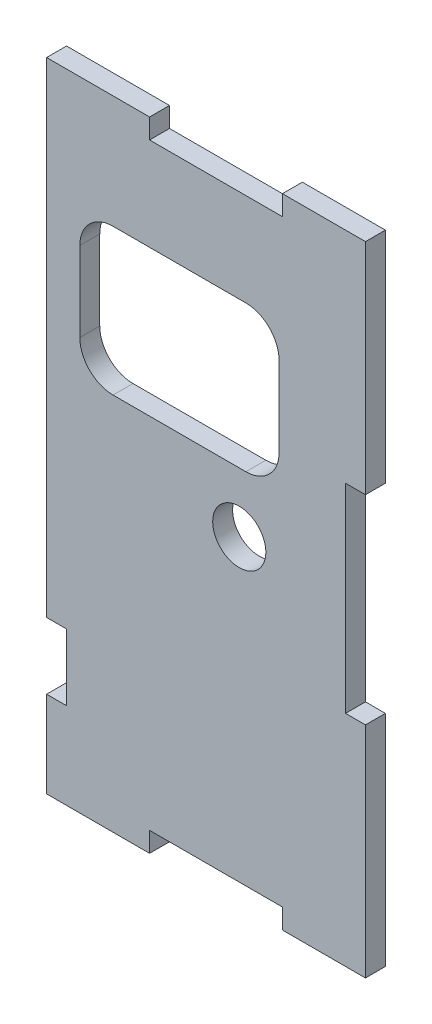
ISO-10303-21;
HEADER;
FILE_DESCRIPTION(('STEP AP214'),'2;1');
FILE_NAME('part.step','',(''),(''),'','','');
FILE_SCHEMA(('AUTOMOTIVE_DESIGN { 1 0 10303 214 1 1 1 1 }'));
ENDSEC;
DATA;
#1=APPLICATION_CONTEXT('core data for automotive mechanical design processes');
#2=APPLICATION_PROTOCOL_DEFINITION('international standard','automotive_design',2000,#1);
#3=PRODUCT_CONTEXT('',#1,'mechanical');
#4=PRODUCT('Part','Part','',(#3));
#5=PRODUCT_RELATED_PRODUCT_CATEGORY('part','',(#4));
#6=PRODUCT_DEFINITION_FORMATION('','',#4);
#7=PRODUCT_DEFINITION_CONTEXT('part definition',#1,'design');
#8=PRODUCT_DEFINITION('design','',#6,#7);
#9=PRODUCT_DEFINITION_SHAPE('','',#8);
#10=(LENGTH_UNIT() NAMED_UNIT(*) SI_UNIT(.MILLI.,.METRE.));
#11=(NAMED_UNIT(*) PLANE_ANGLE_UNIT() SI_UNIT($,.RADIAN.));
#12=(NAMED_UNIT(*) SI_UNIT($,.STERADIAN.) SOLID_ANGLE_UNIT());
#13=UNCERTAINTY_MEASURE_WITH_UNIT(LENGTH_MEASURE(1.E-05),#10,'distance_accuracy_value','');
#14=(GEOMETRIC_REPRESENTATION_CONTEXT(3) GLOBAL_UNCERTAINTY_ASSIGNED_CONTEXT((#13)) GLOBAL_UNIT_ASSIGNED_CONTEXT((#10,
#11,#12)) REPRESENTATION_CONTEXT('',''));
#15=CARTESIAN_POINT('',(0.,0.,0.));
#16=DIRECTION('',(0.,0.,1.));
#17=DIRECTION('',(1.,0.,0.));
#18=AXIS2_PLACEMENT_3D('',#15,#16,#17);
#19=CARTESIAN_POINT('',(48.,96.,3.));
#20=DIRECTION('',(-1.,0.,0.));
#21=DIRECTION('',(0.,-1.,0.));
#22=AXIS2_PLACEMENT_3D('',#19,#20,#21);
#23=PLANE('',#22);
#24=DIRECTION('',(0.,1.,0.));
#25=VECTOR('',#24,1.);
#26=CARTESIAN_POINT('',(48.,96.,3.));
#27=LINE('',#26,#25);
#28=CARTESIAN_POINT('',(48.,63.,3.));
#29=VERTEX_POINT('',#28);
#30=CARTESIAN_POINT('',(48.,96.,3.));
#31=VERTEX_POINT('',#30);
#32=EDGE_CURVE('E357',#29,#31,#27,.T.);
#33=ORIENTED_EDGE('',*,*,#32,.F.);
#34=DIRECTION('',(0.,0.,-1.));
#35=VECTOR('',#34,1.);
#36=CARTESIAN_POINT('',(48.,63.,3.));
#37=LINE('',#36,#35);
#38=CARTESIAN_POINT('',(48.,63.,0.));
#39=VERTEX_POINT('',#38);
#40=EDGE_CURVE('E304',#29,#39,#37,.T.);
#41=ORIENTED_EDGE('',*,*,#40,.T.);
#42=DIRECTION('',(0.,1.,0.));
#43=VECTOR('',#42,1.);
#44=CARTESIAN_POINT('',(48.,96.,0.));
#45=LINE('',#44,#43);
#46=CARTESIAN_POINT('',(48.,96.,0.));
#47=VERTEX_POINT('',#46);
#48=EDGE_CURVE('E386',#39,#47,#45,.T.);
#49=ORIENTED_EDGE('',*,*,#48,.T.);
#50=DIRECTION('',(0.,0.,-1.));
#51=VECTOR('',#50,1.);
#52=CARTESIAN_POINT('',(48.,96.,3.));
#53=LINE('',#52,#51);
#54=EDGE_CURVE('E420',#31,#47,#53,.T.);
#55=ORIENTED_EDGE('',*,*,#54,.F.);
#56=EDGE_LOOP('',(#33,#41,#49,#55));
#57=FACE_BOUND('',#56,.T.);
#58=ADVANCED_FACE('F33',(#57),#23,.F.);
#59=CARTESIAN_POINT('',(0.,0.,3.));
#60=DIRECTION('',(1.,0.,0.));
#61=DIRECTION('',(0.,0.,-1.));
#62=AXIS2_PLACEMENT_3D('',#59,#60,#61);
#63=PLANE('',#62);
#64=DIRECTION('',(0.,-1.,0.));
#65=VECTOR('',#64,1.);
#66=CARTESIAN_POINT('',(0.,0.,3.));
#67=LINE('',#66,#65);
#68=CARTESIAN_POINT('',(0.,13.,3.));
#69=VERTEX_POINT('',#68);
#70=CARTESIAN_POINT('',(0.,0.,3.));
#71=VERTEX_POINT('',#70);
#72=EDGE_CURVE('E371',#69,#71,#67,.T.);
#73=ORIENTED_EDGE('',*,*,#72,.F.);
#74=DIRECTION('',(0.,0.,1.));
#75=VECTOR('',#74,1.);
#76=CARTESIAN_POINT('',(0.,13.,0.));
#77=LINE('',#76,#75);
#78=CARTESIAN_POINT('',(0.,13.,0.));
#79=VERTEX_POINT('',#78);
#80=EDGE_CURVE('E339',#79,#69,#77,.T.);
#81=ORIENTED_EDGE('',*,*,#80,.F.);
#82=DIRECTION('',(0.,-1.,0.));
#83=VECTOR('',#82,1.);
#84=CARTESIAN_POINT('',(0.,0.,0.));
#85=LINE('',#84,#83);
#86=CARTESIAN_POINT('',(0.,0.,0.));
#87=VERTEX_POINT('',#86);
#88=EDGE_CURVE('E400',#79,#87,#85,.T.);
#89=ORIENTED_EDGE('',*,*,#88,.T.);
#90=DIRECTION('',(0.,0.,-1.));
#91=VECTOR('',#90,1.);
#92=CARTESIAN_POINT('',(0.,0.,3.));
#93=LINE('',#92,#91);
#94=EDGE_CURVE('E375',#71,#87,#93,.T.);
#95=ORIENTED_EDGE('',*,*,#94,.F.);
#96=EDGE_LOOP('',(#73,#81,#89,#95));
#97=FACE_BOUND('',#96,.T.);
#98=ADVANCED_FACE('F466',(#97),#63,.F.);
#99=CARTESIAN_POINT('',(15.5,0.,3.));
#100=DIRECTION('',(0.,1.,0.));
#101=DIRECTION('',(-1.,0.,0.));
#102=AXIS2_PLACEMENT_3D('',#99,#100,#101);
#103=PLANE('',#102);
#104=DIRECTION('',(1.,0.,0.));
#105=VECTOR('',#104,1.);
#106=CARTESIAN_POINT('',(15.5,0.,0.));
#107=LINE('',#106,#105);
#108=CARTESIAN_POINT('',(15.5,0.,0.));
#109=VERTEX_POINT('',#108);
#110=EDGE_CURVE('E338',#87,#109,#107,.T.);
#111=ORIENTED_EDGE('',*,*,#110,.T.);
#112=DIRECTION('',(0.,0.,-1.));
#113=VECTOR('',#112,1.);
#114=CARTESIAN_POINT('',(15.5,0.,3.));
#115=LINE('',#114,#113);
#116=CARTESIAN_POINT('',(15.5,0.,3.));
#117=VERTEX_POINT('',#116);
#118=EDGE_CURVE('E11',#117,#109,#115,.T.);
#119=ORIENTED_EDGE('',*,*,#118,.F.);
#120=DIRECTION('',(1.,0.,0.));
#121=VECTOR('',#120,1.);
#122=CARTESIAN_POINT('',(15.5,0.,3.));
#123=LINE('',#122,#121);
#124=EDGE_CURVE('E345',#71,#117,#123,.T.);
#125=ORIENTED_EDGE('',*,*,#124,.F.);
#126=ORIENTED_EDGE('',*,*,#94,.T.);
#127=EDGE_LOOP('',(#111,#119,#125,#126));
#128=FACE_BOUND('',#127,.T.);
#129=ADVANCED_FACE('F35',(#128),#103,.F.);
#130=CARTESIAN_POINT('',(15.5,3.,3.));
#131=DIRECTION('',(-1.,0.,0.));
#132=DIRECTION('',(0.,-1.,0.));
#133=AXIS2_PLACEMENT_3D('',#130,#131,#132);
#134=PLANE('',#133);
#135=DIRECTION('',(0.,1.,0.));
#136=VECTOR('',#135,1.);
#137=CARTESIAN_POINT('',(15.5,3.,0.));
#138=LINE('',#137,#136);
#139=CARTESIAN_POINT('',(15.5,3.,0.));
#140=VERTEX_POINT('',#139);
#141=EDGE_CURVE('E378',#109,#140,#138,.T.);
#142=ORIENTED_EDGE('',*,*,#141,.T.);
#143=DIRECTION('',(0.,0.,-1.));
#144=VECTOR('',#143,1.);
#145=CARTESIAN_POINT('',(15.5,3.,3.));
#146=LINE('',#145,#144);
#147=CARTESIAN_POINT('',(15.5,3.,3.));
#148=VERTEX_POINT('',#147);
#149=EDGE_CURVE('E41',#148,#140,#146,.T.);
#150=ORIENTED_EDGE('',*,*,#149,.F.);
#151=DIRECTION('',(0.,1.,0.));
#152=VECTOR('',#151,1.);
#153=CARTESIAN_POINT('',(15.5,3.,3.));
#154=LINE('',#153,#152);
#155=EDGE_CURVE('E348',#117,#148,#154,.T.);
#156=ORIENTED_EDGE('',*,*,#155,.F.);
#157=ORIENTED_EDGE('',*,*,#118,.T.);
#158=EDGE_LOOP('',(#142,#150,#156,#157));
#159=FACE_BOUND('',#158,.T.);
#160=ADVANCED_FACE('F459',(#159),#134,.F.);
#161=CARTESIAN_POINT('',(35.5,3.00000000000001,3.));
#162=DIRECTION('',(0.,1.,0.));
#163=DIRECTION('',(-1.,0.,0.));
#164=AXIS2_PLACEMENT_3D('',#161,#162,#163);
#165=PLANE('',#164);
#166=DIRECTION('',(1.,0.,0.));
#167=VECTOR('',#166,1.);
#168=CARTESIAN_POINT('',(35.5,3.00000000000001,0.));
#169=LINE('',#168,#167);
#170=CARTESIAN_POINT('',(35.5,3.00000000000001,0.));
#171=VERTEX_POINT('',#170);
#172=EDGE_CURVE('E380',#140,#171,#169,.T.);
#173=ORIENTED_EDGE('',*,*,#172,.T.);
#174=DIRECTION('',(0.,0.,-1.));
#175=VECTOR('',#174,1.);
#176=CARTESIAN_POINT('',(35.5,3.00000000000001,3.));
#177=LINE('',#176,#175);
#178=CARTESIAN_POINT('',(35.5,3.00000000000001,3.));
#179=VERTEX_POINT('',#178);
#180=EDGE_CURVE('E429',#179,#171,#177,.T.);
#181=ORIENTED_EDGE('',*,*,#180,.F.);
#182=DIRECTION('',(1.,0.,0.));
#183=VECTOR('',#182,1.);
#184=CARTESIAN_POINT('',(35.5,3.00000000000001,3.));
#185=LINE('',#184,#183);
#186=EDGE_CURVE('E351',#148,#179,#185,.T.);
#187=ORIENTED_EDGE('',*,*,#186,.F.);
#188=ORIENTED_EDGE('',*,*,#149,.T.);
#189=EDGE_LOOP('',(#173,#181,#187,#188));
#190=FACE_BOUND('',#189,.T.);
#191=ADVANCED_FACE('F436',(#190),#165,.F.);
#192=CARTESIAN_POINT('',(35.5,0.,3.));
#193=DIRECTION('',(1.,0.,0.));
#194=DIRECTION('',(0.,0.,-1.));
#195=AXIS2_PLACEMENT_3D('',#192,#193,#194);
#196=PLANE('',#195);
#197=DIRECTION('',(0.,-1.,0.));
#198=VECTOR('',#197,1.);
#199=CARTESIAN_POINT('',(35.5,0.,0.));
#200=LINE('',#199,#198);
#201=CARTESIAN_POINT('',(35.5,0.,0.));
#202=VERTEX_POINT('',#201);
#203=EDGE_CURVE('E382',#171,#202,#200,.T.);
#204=ORIENTED_EDGE('',*,*,#203,.T.);
#205=DIRECTION('',(0.,0.,-1.));
#206=VECTOR('',#205,1.);
#207=CARTESIAN_POINT('',(35.5,0.,3.));
#208=LINE('',#207,#206);
#209=CARTESIAN_POINT('',(35.5,0.,3.));
#210=VERTEX_POINT('',#209);
#211=EDGE_CURVE('E426',#210,#202,#208,.T.);
#212=ORIENTED_EDGE('',*,*,#211,.F.);
#213=DIRECTION('',(0.,-1.,0.));
#214=VECTOR('',#213,1.);
#215=CARTESIAN_POINT('',(35.5,0.,3.));
#216=LINE('',#215,#214);
#217=EDGE_CURVE('E353',#179,#210,#216,.T.);
#218=ORIENTED_EDGE('',*,*,#217,.F.);
#219=ORIENTED_EDGE('',*,*,#180,.T.);
#220=EDGE_LOOP('',(#204,#212,#218,#219));
#221=FACE_BOUND('',#220,.T.);
#222=ADVANCED_FACE('F449',(#221),#196,.F.);
#223=CARTESIAN_POINT('',(48.,0.,3.));
#224=DIRECTION('',(0.,1.,0.));
#225=DIRECTION('',(-1.,0.,0.));
#226=AXIS2_PLACEMENT_3D('',#223,#224,#225);
#227=PLANE('',#226);
#228=DIRECTION('',(1.,0.,0.));
#229=VECTOR('',#228,1.);
#230=CARTESIAN_POINT('',(48.,0.,0.));
#231=LINE('',#230,#229);
#232=CARTESIAN_POINT('',(48.,0.,0.));
#233=VERTEX_POINT('',#232);
#234=EDGE_CURVE('E384',#202,#233,#231,.T.);
#235=ORIENTED_EDGE('',*,*,#234,.T.);
#236=DIRECTION('',(0.,0.,-1.));
#237=VECTOR('',#236,1.);
#238=CARTESIAN_POINT('',(48.,0.,3.));
#239=LINE('',#238,#237);
#240=CARTESIAN_POINT('',(48.,0.,3.));
#241=VERTEX_POINT('',#240);
#242=EDGE_CURVE('E423',#241,#233,#239,.T.);
#243=ORIENTED_EDGE('',*,*,#242,.F.);
#244=DIRECTION('',(1.,0.,0.));
#245=VECTOR('',#244,1.);
#246=CARTESIAN_POINT('',(48.,0.,3.));
#247=LINE('',#246,#245);
#248=EDGE_CURVE('E355',#210,#241,#247,.T.);
#249=ORIENTED_EDGE('',*,*,#248,.F.);
#250=ORIENTED_EDGE('',*,*,#211,.T.);
#251=EDGE_LOOP('',(#235,#243,#249,#250));
#252=FACE_BOUND('',#251,.T.);
#253=ADVANCED_FACE('F453',(#252),#227,.F.);
#254=CARTESIAN_POINT('',(48.,33.,0.));
#255=VERTEX_POINT('',#254);
#256=EDGE_CURVE('E387',#233,#255,#45,.T.);
#257=ORIENTED_EDGE('',*,*,#256,.T.);
#258=DIRECTION('',(0.,0.,-1.));
#259=VECTOR('',#258,1.);
#260=CARTESIAN_POINT('',(48.,33.,3.));
#261=LINE('',#260,#259);
#262=CARTESIAN_POINT('',(48.,33.,3.));
#263=VERTEX_POINT('',#262);
#264=EDGE_CURVE('E297',#263,#255,#261,.T.);
#265=ORIENTED_EDGE('',*,*,#264,.F.);
#266=EDGE_CURVE('E358',#241,#263,#27,.T.);
#267=ORIENTED_EDGE('',*,*,#266,.F.);
#268=ORIENTED_EDGE('',*,*,#242,.T.);
#269=EDGE_LOOP('',(#257,#265,#267,#268));
#270=FACE_BOUND('',#269,.T.);
#271=ADVANCED_FACE('F521',(#270),#23,.F.);
#272=CARTESIAN_POINT('',(35.5,96.,3.));
#273=DIRECTION('',(0.,-1.,0.));
#274=DIRECTION('',(0.,0.,-1.));
#275=AXIS2_PLACEMENT_3D('',#272,#273,#274);
#276=PLANE('',#275);
#277=DIRECTION('',(-1.,0.,0.));
#278=VECTOR('',#277,1.);
#279=CARTESIAN_POINT('',(35.5,96.,0.));
#280=LINE('',#279,#278);
#281=CARTESIAN_POINT('',(35.5,96.,0.));
#282=VERTEX_POINT('',#281);
#283=EDGE_CURVE('E390',#47,#282,#280,.T.);
#284=ORIENTED_EDGE('',*,*,#283,.T.);
#285=DIRECTION('',(0.,0.,-1.));
#286=VECTOR('',#285,1.);
#287=CARTESIAN_POINT('',(35.5,96.,3.));
#288=LINE('',#287,#286);
#289=CARTESIAN_POINT('',(35.5,96.,3.));
#290=VERTEX_POINT('',#289);
#291=EDGE_CURVE('E417',#290,#282,#288,.T.);
#292=ORIENTED_EDGE('',*,*,#291,.F.);
#293=DIRECTION('',(-1.,0.,0.));
#294=VECTOR('',#293,1.);
#295=CARTESIAN_POINT('',(35.5,96.,3.));
#296=LINE('',#295,#294);
#297=EDGE_CURVE('E361',#31,#290,#296,.T.);
#298=ORIENTED_EDGE('',*,*,#297,.F.);
#299=ORIENTED_EDGE('',*,*,#54,.T.);
#300=EDGE_LOOP('',(#284,#292,#298,#299));
#301=FACE_BOUND('',#300,.T.);
#302=ADVANCED_FACE('F505',(#301),#276,.F.);
#303=CARTESIAN_POINT('',(35.5,93.,3.));
#304=DIRECTION('',(1.,0.,0.));
#305=DIRECTION('',(0.,1.,0.));
#306=AXIS2_PLACEMENT_3D('',#303,#304,#305);
#307=PLANE('',#306);
#308=DIRECTION('',(0.,-1.,0.));
#309=VECTOR('',#308,1.);
#310=CARTESIAN_POINT('',(35.5,93.,0.));
#311=LINE('',#310,#309);
#312=CARTESIAN_POINT('',(35.5,93.,0.));
#313=VERTEX_POINT('',#312);
#314=EDGE_CURVE('E392',#282,#313,#311,.T.);
#315=ORIENTED_EDGE('',*,*,#314,.T.);
#316=DIRECTION('',(0.,0.,-1.));
#317=VECTOR('',#316,1.);
#318=CARTESIAN_POINT('',(35.5,93.,3.));
#319=LINE('',#318,#317);
#320=CARTESIAN_POINT('',(35.5,93.,3.));
#321=VERTEX_POINT('',#320);
#322=EDGE_CURVE('E414',#321,#313,#319,.T.);
#323=ORIENTED_EDGE('',*,*,#322,.F.);
#324=DIRECTION('',(0.,-1.,0.));
#325=VECTOR('',#324,1.);
#326=CARTESIAN_POINT('',(35.5,93.,3.));
#327=LINE('',#326,#325);
#328=EDGE_CURVE('E363',#290,#321,#327,.T.);
#329=ORIENTED_EDGE('',*,*,#328,.F.);
#330=ORIENTED_EDGE('',*,*,#291,.T.);
#331=EDGE_LOOP('',(#315,#323,#329,#330));
#332=FACE_BOUND('',#331,.T.);
#333=ADVANCED_FACE('F500',(#332),#307,.F.);
#334=CARTESIAN_POINT('',(15.5,93.,3.));
#335=DIRECTION('',(0.,-1.,0.));
#336=DIRECTION('',(0.,0.,-1.));
#337=AXIS2_PLACEMENT_3D('',#334,#335,#336);
#338=PLANE('',#337);
#339=DIRECTION('',(-1.,0.,0.));
#340=VECTOR('',#339,1.);
#341=CARTESIAN_POINT('',(15.5,93.,0.));
#342=LINE('',#341,#340);
#343=CARTESIAN_POINT('',(15.5,93.,0.));
#344=VERTEX_POINT('',#343);
#345=EDGE_CURVE('E394',#313,#344,#342,.T.);
#346=ORIENTED_EDGE('',*,*,#345,.T.);
#347=DIRECTION('',(0.,0.,-1.));
#348=VECTOR('',#347,1.);
#349=CARTESIAN_POINT('',(15.5,93.,3.));
#350=LINE('',#349,#348);
#351=CARTESIAN_POINT('',(15.5,93.,3.));
#352=VERTEX_POINT('',#351);
#353=EDGE_CURVE('E411',#352,#344,#350,.T.);
#354=ORIENTED_EDGE('',*,*,#353,.F.);
#355=DIRECTION('',(-1.,0.,0.));
#356=VECTOR('',#355,1.);
#357=CARTESIAN_POINT('',(15.5,93.,3.));
#358=LINE('',#357,#356);
#359=EDGE_CURVE('E365',#321,#352,#358,.T.);
#360=ORIENTED_EDGE('',*,*,#359,.F.);
#361=ORIENTED_EDGE('',*,*,#322,.T.);
#362=EDGE_LOOP('',(#346,#354,#360,#361));
#363=FACE_BOUND('',#362,.T.);
#364=ADVANCED_FACE('F496',(#363),#338,.F.);
#365=CARTESIAN_POINT('',(15.5,96.,3.));
#366=DIRECTION('',(-1.,0.,0.));
#367=DIRECTION('',(0.,0.,1.));
#368=AXIS2_PLACEMENT_3D('',#365,#366,#367);
#369=PLANE('',#368);
#370=DIRECTION('',(0.,1.,0.));
#371=VECTOR('',#370,1.);
#372=CARTESIAN_POINT('',(15.5,96.,0.));
#373=LINE('',#372,#371);
#374=CARTESIAN_POINT('',(15.5,96.,0.));
#375=VERTEX_POINT('',#374);
#376=EDGE_CURVE('E396',#344,#375,#373,.T.);
#377=ORIENTED_EDGE('',*,*,#376,.T.);
#378=DIRECTION('',(0.,0.,-1.));
#379=VECTOR('',#378,1.);
#380=CARTESIAN_POINT('',(15.5,96.,3.));
#381=LINE('',#380,#379);
#382=CARTESIAN_POINT('',(15.5,96.,3.));
#383=VERTEX_POINT('',#382);
#384=EDGE_CURVE('E408',#383,#375,#381,.T.);
#385=ORIENTED_EDGE('',*,*,#384,.F.);
#386=DIRECTION('',(0.,1.,0.));
#387=VECTOR('',#386,1.);
#388=CARTESIAN_POINT('',(15.5,96.,3.));
#389=LINE('',#388,#387);
#390=EDGE_CURVE('E367',#352,#383,#389,.T.);
#391=ORIENTED_EDGE('',*,*,#390,.F.);
#392=ORIENTED_EDGE('',*,*,#353,.T.);
#393=EDGE_LOOP('',(#377,#385,#391,#392));
#394=FACE_BOUND('',#393,.T.);
#395=ADVANCED_FACE('F491',(#394),#369,.F.);
#396=CARTESIAN_POINT('',(0.,96.,3.));
#397=DIRECTION('',(0.,-1.,0.));
#398=DIRECTION('',(0.,0.,-1.));
#399=AXIS2_PLACEMENT_3D('',#396,#397,#398);
#400=PLANE('',#399);
#401=DIRECTION('',(-1.,0.,0.));
#402=VECTOR('',#401,1.);
#403=CARTESIAN_POINT('',(0.,96.,0.));
#404=LINE('',#403,#402);
#405=CARTESIAN_POINT('',(0.,96.,0.));
#406=VERTEX_POINT('',#405);
#407=EDGE_CURVE('E398',#375,#406,#404,.T.);
#408=ORIENTED_EDGE('',*,*,#407,.T.);
#409=DIRECTION('',(0.,0.,-1.));
#410=VECTOR('',#409,1.);
#411=CARTESIAN_POINT('',(0.,96.,3.));
#412=LINE('',#411,#410);
#413=CARTESIAN_POINT('',(0.,96.,3.));
#414=VERTEX_POINT('',#413);
#415=EDGE_CURVE('E405',#414,#406,#412,.T.);
#416=ORIENTED_EDGE('',*,*,#415,.F.);
#417=DIRECTION('',(-1.,0.,0.));
#418=VECTOR('',#417,1.);
#419=CARTESIAN_POINT('',(0.,96.,3.));
#420=LINE('',#419,#418);
#421=EDGE_CURVE('E369',#383,#414,#420,.T.);
#422=ORIENTED_EDGE('',*,*,#421,.F.);
#423=ORIENTED_EDGE('',*,*,#384,.T.);
#424=EDGE_LOOP('',(#408,#416,#422,#423));
#425=FACE_BOUND('',#424,.T.);
#426=ADVANCED_FACE('F485',(#425),#400,.F.);
#427=CARTESIAN_POINT('',(0.,23.,0.));
#428=VERTEX_POINT('',#427);
#429=EDGE_CURVE('E349',#406,#428,#85,.T.);
#430=ORIENTED_EDGE('',*,*,#429,.T.);
#431=DIRECTION('',(0.,0.,1.));
#432=VECTOR('',#431,1.);
#433=CARTESIAN_POINT('',(0.,23.,0.));
#434=LINE('',#433,#432);
#435=CARTESIAN_POINT('',(0.,23.,3.));
#436=VERTEX_POINT('',#435);
#437=EDGE_CURVE('E341',#428,#436,#434,.T.);
#438=ORIENTED_EDGE('',*,*,#437,.T.);
#439=EDGE_CURVE('E372',#414,#436,#67,.T.);
#440=ORIENTED_EDGE('',*,*,#439,.F.);
#441=ORIENTED_EDGE('',*,*,#415,.T.);
#442=EDGE_LOOP('',(#430,#438,#440,#441));
#443=FACE_BOUND('',#442,.T.);
#444=ADVANCED_FACE('F480',(#443),#63,.F.);
#445=CARTESIAN_POINT('',(0.,0.,3.));
#446=DIRECTION('',(0.,0.,-1.));
#447=DIRECTION('',(-1.,0.,0.));
#448=AXIS2_PLACEMENT_3D('',#445,#446,#447);
#449=PLANE('',#448);
#450=DIRECTION('',(0.,-1.,0.));
#451=VECTOR('',#450,1.);
#452=CARTESIAN_POINT('',(35.,62.,3.));
#453=LINE('',#452,#451);
#454=CARTESIAN_POINT('',(35.,74.,3.));
#455=VERTEX_POINT('',#454);
#456=CARTESIAN_POINT('',(35.,62.,3.));
#457=VERTEX_POINT('',#456);
#458=EDGE_CURVE('E226',#455,#457,#453,.T.);
#459=ORIENTED_EDGE('',*,*,#458,.T.);
#460=CARTESIAN_POINT('',(30.,62.,3.));
#461=DIRECTION('',(0.,0.,-1.));
#462=DIRECTION('',(1.,0.,0.));
#463=AXIS2_PLACEMENT_3D('',#460,#461,#462);
#464=CIRCLE('',#463,5.);
#465=CARTESIAN_POINT('',(30.,57.,3.));
#466=VERTEX_POINT('',#465);
#467=EDGE_CURVE('E220',#457,#466,#464,.T.);
#468=ORIENTED_EDGE('',*,*,#467,.T.);
#469=DIRECTION('',(-1.,0.,0.));
#470=VECTOR('',#469,1.);
#471=CARTESIAN_POINT('',(10.,57.,3.));
#472=LINE('',#471,#470);
#473=CARTESIAN_POINT('',(10.,57.,3.));
#474=VERTEX_POINT('',#473);
#475=EDGE_CURVE('E229',#466,#474,#472,.T.);
#476=ORIENTED_EDGE('',*,*,#475,.T.);
#477=CARTESIAN_POINT('',(10.,62.,3.));
#478=DIRECTION('',(0.,0.,-1.));
#479=DIRECTION('',(-1.,0.,0.));
#480=AXIS2_PLACEMENT_3D('',#477,#478,#479);
#481=CIRCLE('',#480,5.);
#482=CARTESIAN_POINT('',(5.,62.,3.));
#483=VERTEX_POINT('',#482);
#484=EDGE_CURVE('E48',#474,#483,#481,.T.);
#485=ORIENTED_EDGE('',*,*,#484,.T.);
#486=DIRECTION('',(0.,1.,0.));
#487=VECTOR('',#486,1.);
#488=CARTESIAN_POINT('',(5.,62.,3.));
#489=LINE('',#488,#487);
#490=CARTESIAN_POINT('',(5.,74.,3.));
#491=VERTEX_POINT('',#490);
#492=EDGE_CURVE('E244',#483,#491,#489,.T.);
#493=ORIENTED_EDGE('',*,*,#492,.T.);
#494=CARTESIAN_POINT('',(10.,74.,3.));
#495=DIRECTION('',(0.,0.,-1.));
#496=DIRECTION('',(-1.,0.,0.));
#497=AXIS2_PLACEMENT_3D('',#494,#495,#496);
#498=CIRCLE('',#497,5.);
#499=CARTESIAN_POINT('',(10.,79.,3.));
#500=VERTEX_POINT('',#499);
#501=EDGE_CURVE('E247',#491,#500,#498,.T.);
#502=ORIENTED_EDGE('',*,*,#501,.T.);
#503=DIRECTION('',(1.,0.,0.));
#504=VECTOR('',#503,1.);
#505=CARTESIAN_POINT('',(10.,79.,3.));
#506=LINE('',#505,#504);
#507=CARTESIAN_POINT('',(30.,79.,3.));
#508=VERTEX_POINT('',#507);
#509=EDGE_CURVE('E250',#500,#508,#506,.T.);
#510=ORIENTED_EDGE('',*,*,#509,.T.);
#511=CARTESIAN_POINT('',(30.,74.,3.));
#512=DIRECTION('',(0.,0.,-1.));
#513=DIRECTION('',(-1.,0.,0.));
#514=AXIS2_PLACEMENT_3D('',#511,#512,#513);
#515=CIRCLE('',#514,5.00000000000002);
#516=EDGE_CURVE('E253',#508,#455,#515,.T.);
#517=ORIENTED_EDGE('',*,*,#516,.T.);
#518=EDGE_LOOP('',(#459,#468,#476,#485,#493,#502,#510,#517));
#519=FACE_BOUND('',#518,.T.);
#520=CARTESIAN_POINT('',(29.,48.,3.));
#521=DIRECTION('',(0.,0.,-1.));
#522=DIRECTION('',(-1.,0.,0.));
#523=AXIS2_PLACEMENT_3D('',#520,#521,#522);
#524=CIRCLE('',#523,4.00000000000001);
#525=CARTESIAN_POINT('',(25.,48.,3.));
#526=VERTEX_POINT('',#525);
#527=EDGE_CURVE('E313',#526,#526,#524,.T.);
#528=ORIENTED_EDGE('',*,*,#527,.T.);
#529=EDGE_LOOP('',(#528));
#530=FACE_BOUND('',#529,.T.);
#531=DIRECTION('',(0.,1.,0.));
#532=VECTOR('',#531,1.);
#533=CARTESIAN_POINT('',(45.,63.,3.));
#534=LINE('',#533,#532);
#535=CARTESIAN_POINT('',(45.,33.,3.));
#536=VERTEX_POINT('',#535);
#537=CARTESIAN_POINT('',(45.,63.,3.));
#538=VERTEX_POINT('',#537);
#539=EDGE_CURVE('E290',#536,#538,#534,.T.);
#540=ORIENTED_EDGE('',*,*,#539,.T.);
#541=DIRECTION('',(1.,0.,0.));
#542=VECTOR('',#541,1.);
#543=CARTESIAN_POINT('',(48.,63.,3.));
#544=LINE('',#543,#542);
#545=EDGE_CURVE('E294',#538,#29,#544,.T.);
#546=ORIENTED_EDGE('',*,*,#545,.T.);
#547=ORIENTED_EDGE('',*,*,#32,.T.);
#548=ORIENTED_EDGE('',*,*,#297,.T.);
#549=ORIENTED_EDGE('',*,*,#328,.T.);
#550=ORIENTED_EDGE('',*,*,#359,.T.);
#551=ORIENTED_EDGE('',*,*,#390,.T.);
#552=ORIENTED_EDGE('',*,*,#421,.T.);
#553=ORIENTED_EDGE('',*,*,#439,.T.);
#554=DIRECTION('',(-1.,0.,0.));
#555=VECTOR('',#554,1.);
#556=CARTESIAN_POINT('',(3.,23.,3.));
#557=LINE('',#556,#555);
#558=CARTESIAN_POINT('',(3.,23.,3.));
#559=VERTEX_POINT('',#558);
#560=EDGE_CURVE('E332',#559,#436,#557,.T.);
#561=ORIENTED_EDGE('',*,*,#560,.F.);
#562=DIRECTION('',(0.,1.,0.));
#563=VECTOR('',#562,1.);
#564=CARTESIAN_POINT('',(3.,23.,3.));
#565=LINE('',#564,#563);
#566=CARTESIAN_POINT('',(3.,13.,3.));
#567=VERTEX_POINT('',#566);
#568=EDGE_CURVE('E316',#567,#559,#565,.T.);
#569=ORIENTED_EDGE('',*,*,#568,.F.);
#570=DIRECTION('',(1.,0.,0.));
#571=VECTOR('',#570,1.);
#572=CARTESIAN_POINT('',(3.,13.,3.));
#573=LINE('',#572,#571);
#574=EDGE_CURVE('E323',#69,#567,#573,.T.);
#575=ORIENTED_EDGE('',*,*,#574,.F.);
#576=ORIENTED_EDGE('',*,*,#72,.T.);
#577=ORIENTED_EDGE('',*,*,#124,.T.);
#578=ORIENTED_EDGE('',*,*,#155,.T.);
#579=ORIENTED_EDGE('',*,*,#186,.T.);
#580=ORIENTED_EDGE('',*,*,#217,.T.);
#581=ORIENTED_EDGE('',*,*,#248,.T.);
#582=ORIENTED_EDGE('',*,*,#266,.T.);
#583=DIRECTION('',(-1.,0.,0.));
#584=VECTOR('',#583,1.);
#585=CARTESIAN_POINT('',(48.,33.,3.));
#586=LINE('',#585,#584);
#587=EDGE_CURVE('E287',#263,#536,#586,.T.);
#588=ORIENTED_EDGE('',*,*,#587,.T.);
#589=EDGE_LOOP('',(#540,#546,#547,#548,#549,#550,#551,#552,#553,#561,#569,#575,#576,#577,#578,
#579,#580,#581,#582,#588));
#590=FACE_BOUND('',#589,.T.);
#591=ADVANCED_FACE('F233',(#519,#530,#590),#449,.F.);
#592=CARTESIAN_POINT('',(0.,0.,0.));
#593=DIRECTION('',(0.,0.,-1.));
#594=DIRECTION('',(-1.,0.,0.));
#595=AXIS2_PLACEMENT_3D('',#592,#593,#594);
#596=PLANE('',#595);
#597=CARTESIAN_POINT('',(30.,62.,0.));
#598=DIRECTION('',(0.,0.,-1.));
#599=DIRECTION('',(1.,0.,0.));
#600=AXIS2_PLACEMENT_3D('',#597,#598,#599);
#601=CIRCLE('',#600,5.);
#602=CARTESIAN_POINT('',(35.,62.,0.));
#603=VERTEX_POINT('',#602);
#604=CARTESIAN_POINT('',(30.,57.,0.));
#605=VERTEX_POINT('',#604);
#606=EDGE_CURVE('E56',#603,#605,#601,.T.);
#607=ORIENTED_EDGE('',*,*,#606,.F.);
#608=DIRECTION('',(0.,-1.,0.));
#609=VECTOR('',#608,1.);
#610=CARTESIAN_POINT('',(35.,62.,0.));
#611=LINE('',#610,#609);
#612=CARTESIAN_POINT('',(35.,74.,0.));
#613=VERTEX_POINT('',#612);
#614=EDGE_CURVE('E237',#613,#603,#611,.T.);
#615=ORIENTED_EDGE('',*,*,#614,.F.);
#616=CARTESIAN_POINT('',(30.,74.,0.));
#617=DIRECTION('',(0.,0.,-1.));
#618=DIRECTION('',(-1.,0.,0.));
#619=AXIS2_PLACEMENT_3D('',#616,#617,#618);
#620=CIRCLE('',#619,5.00000000000002);
#621=CARTESIAN_POINT('',(30.,79.,0.));
#622=VERTEX_POINT('',#621);
#623=EDGE_CURVE('E240',#622,#613,#620,.T.);
#624=ORIENTED_EDGE('',*,*,#623,.F.);
#625=DIRECTION('',(1.,0.,0.));
#626=VECTOR('',#625,1.);
#627=CARTESIAN_POINT('',(10.,79.,0.));
#628=LINE('',#627,#626);
#629=CARTESIAN_POINT('',(10.,79.,0.));
#630=VERTEX_POINT('',#629);
#631=EDGE_CURVE('E268',#630,#622,#628,.T.);
#632=ORIENTED_EDGE('',*,*,#631,.F.);
#633=CARTESIAN_POINT('',(10.,74.,0.));
#634=DIRECTION('',(0.,0.,-1.));
#635=DIRECTION('',(-1.,0.,0.));
#636=AXIS2_PLACEMENT_3D('',#633,#634,#635);
#637=CIRCLE('',#636,5.);
#638=CARTESIAN_POINT('',(5.,74.,0.));
#639=VERTEX_POINT('',#638);
#640=EDGE_CURVE('E265',#639,#630,#637,.T.);
#641=ORIENTED_EDGE('',*,*,#640,.F.);
#642=DIRECTION('',(0.,1.,0.));
#643=VECTOR('',#642,1.);
#644=CARTESIAN_POINT('',(5.,62.,0.));
#645=LINE('',#644,#643);
#646=CARTESIAN_POINT('',(5.,62.,0.));
#647=VERTEX_POINT('',#646);
#648=EDGE_CURVE('E262',#647,#639,#645,.T.);
#649=ORIENTED_EDGE('',*,*,#648,.F.);
#650=CARTESIAN_POINT('',(10.,62.,0.));
#651=DIRECTION('',(0.,0.,-1.));
#652=DIRECTION('',(-1.,0.,0.));
#653=AXIS2_PLACEMENT_3D('',#650,#651,#652);
#654=CIRCLE('',#653,5.);
#655=CARTESIAN_POINT('',(10.,57.,0.));
#656=VERTEX_POINT('',#655);
#657=EDGE_CURVE('E259',#656,#647,#654,.T.);
#658=ORIENTED_EDGE('',*,*,#657,.F.);
#659=DIRECTION('',(-1.,0.,0.));
#660=VECTOR('',#659,1.);
#661=CARTESIAN_POINT('',(10.,57.,0.));
#662=LINE('',#661,#660);
#663=EDGE_CURVE('E257',#605,#656,#662,.T.);
#664=ORIENTED_EDGE('',*,*,#663,.F.);
#665=EDGE_LOOP('',(#607,#615,#624,#632,#641,#649,#658,#664));
#666=FACE_BOUND('',#665,.T.);
#667=DIRECTION('',(1.,0.,0.));
#668=VECTOR('',#667,1.);
#669=CARTESIAN_POINT('',(48.,63.,0.));
#670=LINE('',#669,#668);
#671=CARTESIAN_POINT('',(45.,63.,0.));
#672=VERTEX_POINT('',#671);
#673=EDGE_CURVE('E291',#672,#39,#670,.T.);
#674=ORIENTED_EDGE('',*,*,#673,.F.);
#675=DIRECTION('',(0.,1.,0.));
#676=VECTOR('',#675,1.);
#677=CARTESIAN_POINT('',(45.,63.,0.));
#678=LINE('',#677,#676);
#679=CARTESIAN_POINT('',(45.,33.,0.));
#680=VERTEX_POINT('',#679);
#681=EDGE_CURVE('E300',#680,#672,#678,.T.);
#682=ORIENTED_EDGE('',*,*,#681,.F.);
#683=DIRECTION('',(-1.,0.,0.));
#684=VECTOR('',#683,1.);
#685=CARTESIAN_POINT('',(48.,33.,0.));
#686=LINE('',#685,#684);
#687=EDGE_CURVE('E275',#255,#680,#686,.T.);
#688=ORIENTED_EDGE('',*,*,#687,.F.);
#689=ORIENTED_EDGE('',*,*,#256,.F.);
#690=ORIENTED_EDGE('',*,*,#234,.F.);
#691=ORIENTED_EDGE('',*,*,#203,.F.);
#692=ORIENTED_EDGE('',*,*,#172,.F.);
#693=ORIENTED_EDGE('',*,*,#141,.F.);
#694=ORIENTED_EDGE('',*,*,#110,.F.);
#695=ORIENTED_EDGE('',*,*,#88,.F.);
#696=DIRECTION('',(1.,0.,0.));
#697=VECTOR('',#696,1.);
#698=CARTESIAN_POINT('',(3.,13.,0.));
#699=LINE('',#698,#697);
#700=CARTESIAN_POINT('',(3.,13.,0.));
#701=VERTEX_POINT('',#700);
#702=EDGE_CURVE('E326',#79,#701,#699,.T.);
#703=ORIENTED_EDGE('',*,*,#702,.T.);
#704=DIRECTION('',(0.,1.,0.));
#705=VECTOR('',#704,1.);
#706=CARTESIAN_POINT('',(3.,23.,0.));
#707=LINE('',#706,#705);
#708=CARTESIAN_POINT('',(3.,23.,0.));
#709=VERTEX_POINT('',#708);
#710=EDGE_CURVE('E319',#701,#709,#707,.T.);
#711=ORIENTED_EDGE('',*,*,#710,.T.);
#712=DIRECTION('',(-1.,0.,0.));
#713=VECTOR('',#712,1.);
#714=CARTESIAN_POINT('',(3.,23.,0.));
#715=LINE('',#714,#713);
#716=EDGE_CURVE('E322',#709,#428,#715,.T.);
#717=ORIENTED_EDGE('',*,*,#716,.T.);
#718=ORIENTED_EDGE('',*,*,#429,.F.);
#719=ORIENTED_EDGE('',*,*,#407,.F.);
#720=ORIENTED_EDGE('',*,*,#376,.F.);
#721=ORIENTED_EDGE('',*,*,#345,.F.);
#722=ORIENTED_EDGE('',*,*,#314,.F.);
#723=ORIENTED_EDGE('',*,*,#283,.F.);
#724=ORIENTED_EDGE('',*,*,#48,.F.);
#725=EDGE_LOOP('',(#674,#682,#688,#689,#690,#691,#692,#693,#694,#695,#703,#711,#717,#718,#719,
#720,#721,#722,#723,#724));
#726=FACE_BOUND('',#725,.T.);
#727=CARTESIAN_POINT('',(29.,48.,0.));
#728=DIRECTION('',(0.,0.,-1.));
#729=DIRECTION('',(-1.,0.,0.));
#730=AXIS2_PLACEMENT_3D('',#727,#728,#729);
#731=CIRCLE('',#730,4.00000000000001);
#732=CARTESIAN_POINT('',(25.,48.,0.));
#733=VERTEX_POINT('',#732);
#734=EDGE_CURVE('E307',#733,#733,#731,.T.);
#735=ORIENTED_EDGE('',*,*,#734,.F.);
#736=EDGE_LOOP('',(#735));
#737=FACE_BOUND('',#736,.T.);
#738=ADVANCED_FACE('F442',(#666,#726,#737),#596,.T.);
#739=CARTESIAN_POINT('',(3.,23.,0.));
#740=DIRECTION('',(1.,0.,0.));
#741=DIRECTION('',(0.,0.,-1.));
#742=AXIS2_PLACEMENT_3D('',#739,#740,#741);
#743=PLANE('',#742);
#744=ORIENTED_EDGE('',*,*,#568,.T.);
#745=DIRECTION('',(0.,0.,1.));
#746=VECTOR('',#745,1.);
#747=CARTESIAN_POINT('',(3.,23.,0.));
#748=LINE('',#747,#746);
#749=EDGE_CURVE('E329',#709,#559,#748,.T.);
#750=ORIENTED_EDGE('',*,*,#749,.F.);
#751=ORIENTED_EDGE('',*,*,#710,.F.);
#752=DIRECTION('',(0.,0.,1.));
#753=VECTOR('',#752,1.);
#754=CARTESIAN_POINT('',(3.,13.,0.));
#755=LINE('',#754,#753);
#756=EDGE_CURVE('E336',#701,#567,#755,.T.);
#757=ORIENTED_EDGE('',*,*,#756,.T.);
#758=EDGE_LOOP('',(#744,#750,#751,#757));
#759=FACE_BOUND('',#758,.T.);
#760=ADVANCED_FACE('F473',(#759),#743,.F.);
#761=CARTESIAN_POINT('',(3.,13.,0.));
#762=DIRECTION('',(0.,-1.,0.));
#763=DIRECTION('',(0.,0.,-1.));
#764=AXIS2_PLACEMENT_3D('',#761,#762,#763);
#765=PLANE('',#764);
#766=ORIENTED_EDGE('',*,*,#574,.T.);
#767=ORIENTED_EDGE('',*,*,#756,.F.);
#768=ORIENTED_EDGE('',*,*,#702,.F.);
#769=ORIENTED_EDGE('',*,*,#80,.T.);
#770=EDGE_LOOP('',(#766,#767,#768,#769));
#771=FACE_BOUND('',#770,.T.);
#772=ADVANCED_FACE('F469',(#771),#765,.F.);
#773=CARTESIAN_POINT('',(3.,23.,0.));
#774=DIRECTION('',(0.,1.,0.));
#775=DIRECTION('',(0.,0.,1.));
#776=AXIS2_PLACEMENT_3D('',#773,#774,#775);
#777=PLANE('',#776);
#778=ORIENTED_EDGE('',*,*,#560,.T.);
#779=ORIENTED_EDGE('',*,*,#437,.F.);
#780=ORIENTED_EDGE('',*,*,#716,.F.);
#781=ORIENTED_EDGE('',*,*,#749,.T.);
#782=EDGE_LOOP('',(#778,#779,#780,#781));
#783=FACE_BOUND('',#782,.T.);
#784=ADVANCED_FACE('F595',(#783),#777,.F.);
#785=CARTESIAN_POINT('',(29.,48.,3.));
#786=DIRECTION('',(0.,0.,-1.));
#787=DIRECTION('',(-1.,0.,0.));
#788=AXIS2_PLACEMENT_3D('',#785,#786,#787);
#789=CYLINDRICAL_SURFACE('',#788,4.00000000000001);
#790=ORIENTED_EDGE('',*,*,#527,.F.);
#791=EDGE_LOOP('',(#790));
#792=FACE_BOUND('',#791,.T.);
#793=ORIENTED_EDGE('',*,*,#734,.T.);
#794=EDGE_LOOP('',(#793));
#795=FACE_BOUND('',#794,.T.);
#796=ADVANCED_FACE('F604',(#792,#795),#789,.F.);
#797=CARTESIAN_POINT('',(48.,63.,3.));
#798=DIRECTION('',(0.,1.,0.));
#799=DIRECTION('',(0.,0.,1.));
#800=AXIS2_PLACEMENT_3D('',#797,#798,#799);
#801=PLANE('',#800);
#802=ORIENTED_EDGE('',*,*,#673,.T.);
#803=ORIENTED_EDGE('',*,*,#40,.F.);
#804=ORIENTED_EDGE('',*,*,#545,.F.);
#805=DIRECTION('',(0.,0.,-1.));
#806=VECTOR('',#805,1.);
#807=CARTESIAN_POINT('',(45.,63.,3.));
#808=LINE('',#807,#806);
#809=EDGE_CURVE('E308',#538,#672,#808,.T.);
#810=ORIENTED_EDGE('',*,*,#809,.T.);
#811=EDGE_LOOP('',(#802,#803,#804,#810));
#812=FACE_BOUND('',#811,.T.);
#813=ADVANCED_FACE('F512',(#812),#801,.F.);
#814=CARTESIAN_POINT('',(45.,63.,3.));
#815=DIRECTION('',(-1.,0.,0.));
#816=DIRECTION('',(0.,-1.,0.));
#817=AXIS2_PLACEMENT_3D('',#814,#815,#816);
#818=PLANE('',#817);
#819=ORIENTED_EDGE('',*,*,#681,.T.);
#820=ORIENTED_EDGE('',*,*,#809,.F.);
#821=ORIENTED_EDGE('',*,*,#539,.F.);
#822=DIRECTION('',(0.,0.,-1.));
#823=VECTOR('',#822,1.);
#824=CARTESIAN_POINT('',(45.,33.,3.));
#825=LINE('',#824,#823);
#826=EDGE_CURVE('E310',#536,#680,#825,.T.);
#827=ORIENTED_EDGE('',*,*,#826,.T.);
#828=EDGE_LOOP('',(#819,#820,#821,#827));
#829=FACE_BOUND('',#828,.T.);
#830=ADVANCED_FACE('F515',(#829),#818,.F.);
#831=CARTESIAN_POINT('',(48.,33.,3.));
#832=DIRECTION('',(0.,-1.,0.));
#833=DIRECTION('',(0.,0.,-1.));
#834=AXIS2_PLACEMENT_3D('',#831,#832,#833);
#835=PLANE('',#834);
#836=ORIENTED_EDGE('',*,*,#687,.T.);
#837=ORIENTED_EDGE('',*,*,#826,.F.);
#838=ORIENTED_EDGE('',*,*,#587,.F.);
#839=ORIENTED_EDGE('',*,*,#264,.T.);
#840=EDGE_LOOP('',(#836,#837,#838,#839));
#841=FACE_BOUND('',#840,.T.);
#842=ADVANCED_FACE('F522',(#841),#835,.F.);
#843=CARTESIAN_POINT('',(30.,62.,3.));
#844=DIRECTION('',(0.,0.,-1.));
#845=DIRECTION('',(-1.,0.,0.));
#846=AXIS2_PLACEMENT_3D('',#843,#844,#845);
#847=CYLINDRICAL_SURFACE('',#846,5.);
#848=ORIENTED_EDGE('',*,*,#606,.T.);
#849=DIRECTION('',(0.,0.,-1.));
#850=VECTOR('',#849,1.);
#851=CARTESIAN_POINT('',(30.,57.,3.));
#852=LINE('',#851,#850);
#853=EDGE_CURVE('E216',#466,#605,#852,.T.);
#854=ORIENTED_EDGE('',*,*,#853,.F.);
#855=ORIENTED_EDGE('',*,*,#467,.F.);
#856=DIRECTION('',(0.,0.,-1.));
#857=VECTOR('',#856,1.);
#858=CARTESIAN_POINT('',(35.,62.,3.));
#859=LINE('',#858,#857);
#860=EDGE_CURVE('E273',#457,#603,#859,.T.);
#861=ORIENTED_EDGE('',*,*,#860,.T.);
#862=EDGE_LOOP('',(#848,#854,#855,#861));
#863=FACE_BOUND('',#862,.T.);
#864=ADVANCED_FACE('F218',(#863),#847,.F.);
#865=CARTESIAN_POINT('',(35.,62.,3.));
#866=DIRECTION('',(1.,0.,0.));
#867=DIRECTION('',(0.,1.,0.));
#868=AXIS2_PLACEMENT_3D('',#865,#866,#867);
#869=PLANE('',#868);
#870=ORIENTED_EDGE('',*,*,#614,.T.);
#871=ORIENTED_EDGE('',*,*,#860,.F.);
#872=ORIENTED_EDGE('',*,*,#458,.F.);
#873=DIRECTION('',(0.,0.,-1.));
#874=VECTOR('',#873,1.);
#875=CARTESIAN_POINT('',(35.,74.,3.));
#876=LINE('',#875,#874);
#877=EDGE_CURVE('E276',#455,#613,#876,.T.);
#878=ORIENTED_EDGE('',*,*,#877,.T.);
#879=EDGE_LOOP('',(#870,#871,#872,#878));
#880=FACE_BOUND('',#879,.T.);
#881=ADVANCED_FACE('F529',(#880),#869,.F.);
#882=CARTESIAN_POINT('',(30.,74.,3.));
#883=DIRECTION('',(0.,0.,-1.));
#884=DIRECTION('',(-1.,0.,0.));
#885=AXIS2_PLACEMENT_3D('',#882,#883,#884);
#886=CYLINDRICAL_SURFACE('',#885,5.00000000000002);
#887=ORIENTED_EDGE('',*,*,#623,.T.);
#888=ORIENTED_EDGE('',*,*,#877,.F.);
#889=ORIENTED_EDGE('',*,*,#516,.F.);
#890=DIRECTION('',(0.,0.,-1.));
#891=VECTOR('',#890,1.);
#892=CARTESIAN_POINT('',(30.,79.,3.));
#893=LINE('',#892,#891);
#894=EDGE_CURVE('E278',#508,#622,#893,.T.);
#895=ORIENTED_EDGE('',*,*,#894,.T.);
#896=EDGE_LOOP('',(#887,#888,#889,#895));
#897=FACE_BOUND('',#896,.T.);
#898=ADVANCED_FACE('F668',(#897),#886,.F.);
#899=CARTESIAN_POINT('',(10.,79.,3.));
#900=DIRECTION('',(0.,1.,0.));
#901=DIRECTION('',(0.,0.,1.));
#902=AXIS2_PLACEMENT_3D('',#899,#900,#901);
#903=PLANE('',#902);
#904=ORIENTED_EDGE('',*,*,#631,.T.);
#905=ORIENTED_EDGE('',*,*,#894,.F.);
#906=ORIENTED_EDGE('',*,*,#509,.F.);
#907=DIRECTION('',(0.,0.,-1.));
#908=VECTOR('',#907,1.);
#909=CARTESIAN_POINT('',(10.,79.,3.));
#910=LINE('',#909,#908);
#911=EDGE_CURVE('E280',#500,#630,#910,.T.);
#912=ORIENTED_EDGE('',*,*,#911,.T.);
#913=EDGE_LOOP('',(#904,#905,#906,#912));
#914=FACE_BOUND('',#913,.T.);
#915=ADVANCED_FACE('F678',(#914),#903,.F.);
#916=CARTESIAN_POINT('',(10.,74.,3.));
#917=DIRECTION('',(0.,0.,-1.));
#918=DIRECTION('',(-1.,0.,0.));
#919=AXIS2_PLACEMENT_3D('',#916,#917,#918);
#920=CYLINDRICAL_SURFACE('',#919,5.);
#921=ORIENTED_EDGE('',*,*,#640,.T.);
#922=ORIENTED_EDGE('',*,*,#911,.F.);
#923=ORIENTED_EDGE('',*,*,#501,.F.);
#924=DIRECTION('',(0.,0.,-1.));
#925=VECTOR('',#924,1.);
#926=CARTESIAN_POINT('',(5.,74.,3.));
#927=LINE('',#926,#925);
#928=EDGE_CURVE('E282',#491,#639,#927,.T.);
#929=ORIENTED_EDGE('',*,*,#928,.T.);
#930=EDGE_LOOP('',(#921,#922,#923,#929));
#931=FACE_BOUND('',#930,.T.);
#932=ADVANCED_FACE('F688',(#931),#920,.F.);
#933=CARTESIAN_POINT('',(5.,62.,3.));
#934=DIRECTION('',(-1.,0.,0.));
#935=DIRECTION('',(0.,0.,1.));
#936=AXIS2_PLACEMENT_3D('',#933,#934,#935);
#937=PLANE('',#936);
#938=ORIENTED_EDGE('',*,*,#648,.T.);
#939=ORIENTED_EDGE('',*,*,#928,.F.);
#940=ORIENTED_EDGE('',*,*,#492,.F.);
#941=DIRECTION('',(0.,0.,-1.));
#942=VECTOR('',#941,1.);
#943=CARTESIAN_POINT('',(5.,62.,3.));
#944=LINE('',#943,#942);
#945=EDGE_CURVE('E284',#483,#647,#944,.T.);
#946=ORIENTED_EDGE('',*,*,#945,.T.);
#947=EDGE_LOOP('',(#938,#939,#940,#946));
#948=FACE_BOUND('',#947,.T.);
#949=ADVANCED_FACE('F698',(#948),#937,.F.);
#950=CARTESIAN_POINT('',(10.,62.,3.));
#951=DIRECTION('',(0.,0.,-1.));
#952=DIRECTION('',(-1.,0.,0.));
#953=AXIS2_PLACEMENT_3D('',#950,#951,#952);
#954=CYLINDRICAL_SURFACE('',#953,5.);
#955=ORIENTED_EDGE('',*,*,#657,.T.);
#956=ORIENTED_EDGE('',*,*,#945,.F.);
#957=ORIENTED_EDGE('',*,*,#484,.F.);
#958=DIRECTION('',(0.,0.,-1.));
#959=VECTOR('',#958,1.);
#960=CARTESIAN_POINT('',(10.,57.,3.));
#961=LINE('',#960,#959);
#962=EDGE_CURVE('E225',#474,#656,#961,.T.);
#963=ORIENTED_EDGE('',*,*,#962,.T.);
#964=EDGE_LOOP('',(#955,#956,#957,#963));
#965=FACE_BOUND('',#964,.T.);
#966=ADVANCED_FACE('F708',(#965),#954,.F.);
#967=CARTESIAN_POINT('',(10.,57.,3.));
#968=DIRECTION('',(0.,-1.,0.));
#969=DIRECTION('',(1.,0.,0.));
#970=AXIS2_PLACEMENT_3D('',#967,#968,#969);
#971=PLANE('',#970);
#972=ORIENTED_EDGE('',*,*,#663,.T.);
#973=ORIENTED_EDGE('',*,*,#962,.F.);
#974=ORIENTED_EDGE('',*,*,#475,.F.);
#975=ORIENTED_EDGE('',*,*,#853,.T.);
#976=EDGE_LOOP('',(#972,#973,#974,#975));
#977=FACE_BOUND('',#976,.T.);
#978=ADVANCED_FACE('F230',(#977),#971,.F.);
#979=CLOSED_SHELL('',(#58,#98,#129,#160,#191,#222,#253,#271,#302,#333,#364,#395,#426,#444,#591,
#738,#760,#772,#784,#796,#813,#830,#842,#864,#881,#898,#915,#932,#949,#966,#978));
#980=MANIFOLD_SOLID_BREP('B2',#979);
#981=ADVANCED_BREP_SHAPE_REPRESENTATION('',(#18,#980),#14);
#982=SHAPE_DEFINITION_REPRESENTATION(#9,#981);
ENDSEC;
END-ISO-10303-21;
